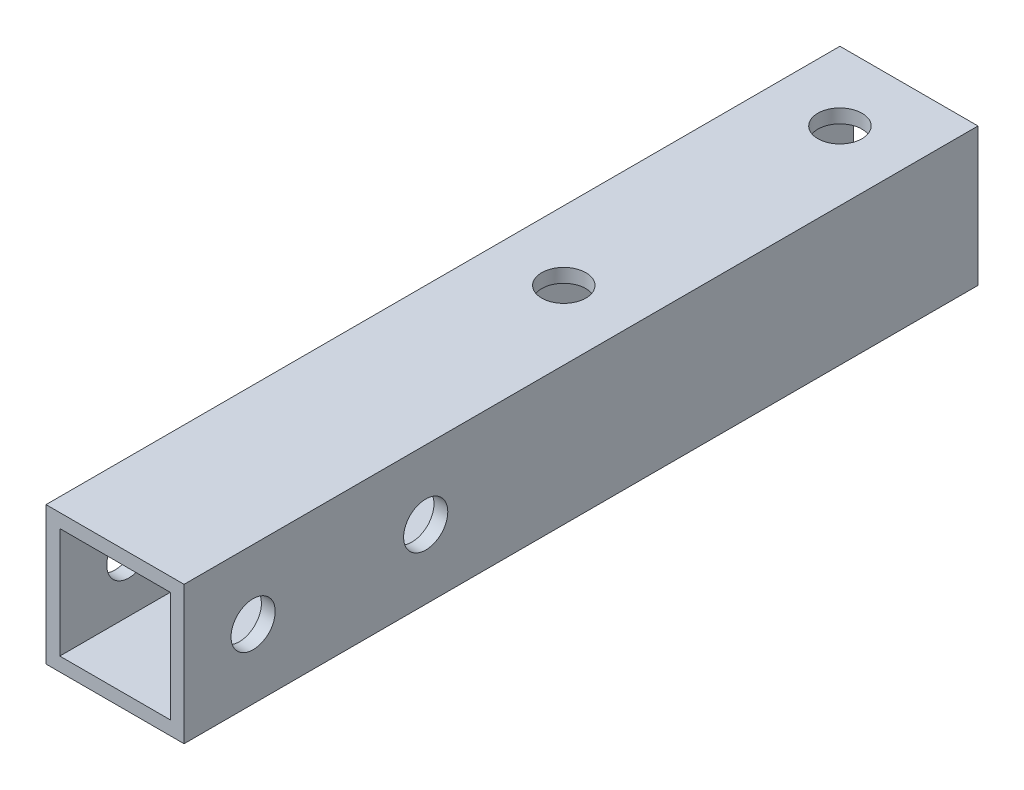
ISO-10303-21;
HEADER;
FILE_DESCRIPTION(('STEP AP214'),'2;1');
FILE_NAME('part.step','',(''),(''),'','','');
FILE_SCHEMA(('AUTOMOTIVE_DESIGN { 1 0 10303 214 1 1 1 1 }'));
ENDSEC;
DATA;
#1=APPLICATION_CONTEXT('core data for automotive mechanical design processes');
#2=APPLICATION_PROTOCOL_DEFINITION('international standard','automotive_design',2000,#1);
#3=PRODUCT_CONTEXT('',#1,'mechanical');
#4=PRODUCT('Part','Part','',(#3));
#5=PRODUCT_RELATED_PRODUCT_CATEGORY('part','',(#4));
#6=PRODUCT_DEFINITION_FORMATION('','',#4);
#7=PRODUCT_DEFINITION_CONTEXT('part definition',#1,'design');
#8=PRODUCT_DEFINITION('design','',#6,#7);
#9=PRODUCT_DEFINITION_SHAPE('','',#8);
#10=(LENGTH_UNIT() NAMED_UNIT(*) SI_UNIT(.MILLI.,.METRE.));
#11=(NAMED_UNIT(*) PLANE_ANGLE_UNIT() SI_UNIT($,.RADIAN.));
#12=(NAMED_UNIT(*) SI_UNIT($,.STERADIAN.) SOLID_ANGLE_UNIT());
#13=UNCERTAINTY_MEASURE_WITH_UNIT(LENGTH_MEASURE(1.E-05),#10,'distance_accuracy_value','');
#14=(GEOMETRIC_REPRESENTATION_CONTEXT(3) GLOBAL_UNCERTAINTY_ASSIGNED_CONTEXT((#13)) GLOBAL_UNIT_ASSIGNED_CONTEXT((#10,
#11,#12)) REPRESENTATION_CONTEXT('',''));
#15=CARTESIAN_POINT('',(0.,0.,0.));
#16=DIRECTION('',(0.,0.,1.));
#17=DIRECTION('',(1.,0.,0.));
#18=AXIS2_PLACEMENT_3D('',#15,#16,#17);
#19=CARTESIAN_POINT('',(0.,0.,57.5));
#20=DIRECTION('',(0.,0.,1.));
#21=DIRECTION('',(1.,0.,0.));
#22=AXIS2_PLACEMENT_3D('',#19,#20,#21);
#23=PLANE('',#22);
#24=DIRECTION('',(0.,1.,0.));
#25=VECTOR('',#24,1.);
#26=CARTESIAN_POINT('',(5.,-5.,57.5));
#27=LINE('',#26,#25);
#28=CARTESIAN_POINT('',(5.,-5.,57.5));
#29=VERTEX_POINT('',#28);
#30=CARTESIAN_POINT('',(5.,5.,57.5));
#31=VERTEX_POINT('',#30);
#32=EDGE_CURVE('E164',#29,#31,#27,.T.);
#33=ORIENTED_EDGE('',*,*,#32,.T.);
#34=DIRECTION('',(-1.,0.,0.));
#35=VECTOR('',#34,1.);
#36=CARTESIAN_POINT('',(-5.,5.,57.5));
#37=LINE('',#36,#35);
#38=CARTESIAN_POINT('',(-5.,5.,57.5));
#39=VERTEX_POINT('',#38);
#40=EDGE_CURVE('E167',#31,#39,#37,.T.);
#41=ORIENTED_EDGE('',*,*,#40,.T.);
#42=DIRECTION('',(0.,-1.,0.));
#43=VECTOR('',#42,1.);
#44=CARTESIAN_POINT('',(-5.,-5.,57.5));
#45=LINE('',#44,#43);
#46=CARTESIAN_POINT('',(-5.,-5.,57.5));
#47=VERTEX_POINT('',#46);
#48=EDGE_CURVE('E170',#39,#47,#45,.T.);
#49=ORIENTED_EDGE('',*,*,#48,.T.);
#50=DIRECTION('',(1.,0.,0.));
#51=VECTOR('',#50,1.);
#52=CARTESIAN_POINT('',(-5.,-5.,57.5));
#53=LINE('',#52,#51);
#54=EDGE_CURVE('E172',#47,#29,#53,.T.);
#55=ORIENTED_EDGE('',*,*,#54,.T.);
#56=EDGE_LOOP('',(#33,#41,#49,#55));
#57=FACE_BOUND('',#56,.T.);
#58=DIRECTION('',(-1.,0.,0.));
#59=VECTOR('',#58,1.);
#60=CARTESIAN_POINT('',(0.,4.,57.5));
#61=LINE('',#60,#59);
#62=CARTESIAN_POINT('',(4.,4.,57.5));
#63=VERTEX_POINT('',#62);
#64=CARTESIAN_POINT('',(-4.,4.,57.5));
#65=VERTEX_POINT('',#64);
#66=EDGE_CURVE('E134',#63,#65,#61,.T.);
#67=ORIENTED_EDGE('',*,*,#66,.F.);
#68=DIRECTION('',(0.,1.,0.));
#69=VECTOR('',#68,1.);
#70=CARTESIAN_POINT('',(4.,0.,57.5));
#71=LINE('',#70,#69);
#72=CARTESIAN_POINT('',(4.,-4.,57.5));
#73=VERTEX_POINT('',#72);
#74=EDGE_CURVE('E126',#73,#63,#71,.T.);
#75=ORIENTED_EDGE('',*,*,#74,.F.);
#76=DIRECTION('',(1.,0.,0.));
#77=VECTOR('',#76,1.);
#78=CARTESIAN_POINT('',(0.,-4.,57.5));
#79=LINE('',#78,#77);
#80=CARTESIAN_POINT('',(-4.,-4.,57.5));
#81=VERTEX_POINT('',#80);
#82=EDGE_CURVE('E148',#81,#73,#79,.T.);
#83=ORIENTED_EDGE('',*,*,#82,.F.);
#84=DIRECTION('',(0.,-1.,0.));
#85=VECTOR('',#84,1.);
#86=CARTESIAN_POINT('',(-4.,0.,57.5));
#87=LINE('',#86,#85);
#88=EDGE_CURVE('E146',#65,#81,#87,.T.);
#89=ORIENTED_EDGE('',*,*,#88,.F.);
#90=EDGE_LOOP('',(#67,#75,#83,#89));
#91=FACE_BOUND('',#90,.T.);
#92=ADVANCED_FACE('F59',(#57,#91),#23,.T.);
#93=CARTESIAN_POINT('',(0.,0.,0.));
#94=DIRECTION('',(0.,0.,1.));
#95=DIRECTION('',(1.,0.,0.));
#96=AXIS2_PLACEMENT_3D('',#93,#94,#95);
#97=PLANE('',#96);
#98=DIRECTION('',(0.,1.,0.));
#99=VECTOR('',#98,1.);
#100=CARTESIAN_POINT('',(5.,-5.,0.));
#101=LINE('',#100,#99);
#102=CARTESIAN_POINT('',(5.,-5.,0.));
#103=VERTEX_POINT('',#102);
#104=CARTESIAN_POINT('',(5.,5.,0.));
#105=VERTEX_POINT('',#104);
#106=EDGE_CURVE('E142',#103,#105,#101,.T.);
#107=ORIENTED_EDGE('',*,*,#106,.F.);
#108=DIRECTION('',(1.,0.,0.));
#109=VECTOR('',#108,1.);
#110=CARTESIAN_POINT('',(-5.,-5.,0.));
#111=LINE('',#110,#109);
#112=CARTESIAN_POINT('',(-5.,-5.,0.));
#113=VERTEX_POINT('',#112);
#114=EDGE_CURVE('E168',#113,#103,#111,.T.);
#115=ORIENTED_EDGE('',*,*,#114,.F.);
#116=DIRECTION('',(0.,-1.,0.));
#117=VECTOR('',#116,1.);
#118=CARTESIAN_POINT('',(-5.,-5.,0.));
#119=LINE('',#118,#117);
#120=CARTESIAN_POINT('',(-5.,5.,0.));
#121=VERTEX_POINT('',#120);
#122=EDGE_CURVE('E179',#121,#113,#119,.T.);
#123=ORIENTED_EDGE('',*,*,#122,.F.);
#124=DIRECTION('',(-1.,0.,0.));
#125=VECTOR('',#124,1.);
#126=CARTESIAN_POINT('',(-5.,5.,0.));
#127=LINE('',#126,#125);
#128=EDGE_CURVE('E177',#105,#121,#127,.T.);
#129=ORIENTED_EDGE('',*,*,#128,.F.);
#130=EDGE_LOOP('',(#107,#115,#123,#129));
#131=FACE_BOUND('',#130,.T.);
#132=DIRECTION('',(0.,1.,0.));
#133=VECTOR('',#132,1.);
#134=CARTESIAN_POINT('',(4.,0.,0.));
#135=LINE('',#134,#133);
#136=CARTESIAN_POINT('',(4.,-4.,0.));
#137=VERTEX_POINT('',#136);
#138=CARTESIAN_POINT('',(4.,4.,0.));
#139=VERTEX_POINT('',#138);
#140=EDGE_CURVE('E84',#137,#139,#135,.T.);
#141=ORIENTED_EDGE('',*,*,#140,.T.);
#142=DIRECTION('',(-1.,0.,0.));
#143=VECTOR('',#142,1.);
#144=CARTESIAN_POINT('',(0.,4.,0.));
#145=LINE('',#144,#143);
#146=CARTESIAN_POINT('',(-4.,4.,0.));
#147=VERTEX_POINT('',#146);
#148=EDGE_CURVE('E141',#139,#147,#145,.T.);
#149=ORIENTED_EDGE('',*,*,#148,.T.);
#150=DIRECTION('',(0.,-1.,0.));
#151=VECTOR('',#150,1.);
#152=CARTESIAN_POINT('',(-4.,0.,0.));
#153=LINE('',#152,#151);
#154=CARTESIAN_POINT('',(-4.,-4.,0.));
#155=VERTEX_POINT('',#154);
#156=EDGE_CURVE('E156',#147,#155,#153,.T.);
#157=ORIENTED_EDGE('',*,*,#156,.T.);
#158=DIRECTION('',(1.,0.,0.));
#159=VECTOR('',#158,1.);
#160=CARTESIAN_POINT('',(0.,-4.,0.));
#161=LINE('',#160,#159);
#162=EDGE_CURVE('E135',#155,#137,#161,.T.);
#163=ORIENTED_EDGE('',*,*,#162,.T.);
#164=EDGE_LOOP('',(#141,#149,#157,#163));
#165=FACE_BOUND('',#164,.T.);
#166=ADVANCED_FACE('F267',(#131,#165),#97,.F.);
#167=CARTESIAN_POINT('',(5.,-5.,57.5));
#168=DIRECTION('',(-1.,0.,0.));
#169=DIRECTION('',(0.,0.,1.));
#170=AXIS2_PLACEMENT_3D('',#167,#168,#169);
#171=PLANE('',#170);
#172=CARTESIAN_POINT('',(5.,0.,40.));
#173=DIRECTION('',(1.,0.,0.));
#174=DIRECTION('',(0.,0.,-1.));
#175=AXIS2_PLACEMENT_3D('',#172,#173,#174);
#176=CIRCLE('',#175,1.6);
#177=CARTESIAN_POINT('',(5.,0.,38.4));
#178=VERTEX_POINT('',#177);
#179=EDGE_CURVE('E205',#178,#178,#176,.T.);
#180=ORIENTED_EDGE('',*,*,#179,.F.);
#181=EDGE_LOOP('',(#180));
#182=FACE_BOUND('',#181,.T.);
#183=CARTESIAN_POINT('',(5.,0.,52.5));
#184=DIRECTION('',(1.,0.,0.));
#185=DIRECTION('',(0.,0.,-1.));
#186=AXIS2_PLACEMENT_3D('',#183,#184,#185);
#187=CIRCLE('',#186,1.6);
#188=CARTESIAN_POINT('',(5.,0.,50.9));
#189=VERTEX_POINT('',#188);
#190=EDGE_CURVE('E215',#189,#189,#187,.T.);
#191=ORIENTED_EDGE('',*,*,#190,.F.);
#192=EDGE_LOOP('',(#191));
#193=FACE_BOUND('',#192,.T.);
#194=ORIENTED_EDGE('',*,*,#106,.T.);
#195=DIRECTION('',(0.,0.,-1.));
#196=VECTOR('',#195,1.);
#197=CARTESIAN_POINT('',(5.,5.,57.5));
#198=LINE('',#197,#196);
#199=EDGE_CURVE('E12',#31,#105,#198,.T.);
#200=ORIENTED_EDGE('',*,*,#199,.F.);
#201=ORIENTED_EDGE('',*,*,#32,.F.);
#202=DIRECTION('',(0.,0.,-1.));
#203=VECTOR('',#202,1.);
#204=CARTESIAN_POINT('',(5.,-5.,57.5));
#205=LINE('',#204,#203);
#206=EDGE_CURVE('E174',#29,#103,#205,.T.);
#207=ORIENTED_EDGE('',*,*,#206,.T.);
#208=EDGE_LOOP('',(#194,#200,#201,#207));
#209=FACE_BOUND('',#208,.T.);
#210=ADVANCED_FACE('F61',(#182,#193,#209),#171,.F.);
#211=CARTESIAN_POINT('',(-5.,5.,57.5));
#212=DIRECTION('',(0.,-1.,0.));
#213=DIRECTION('',(0.,0.,-1.));
#214=AXIS2_PLACEMENT_3D('',#211,#212,#213);
#215=PLANE('',#214);
#216=CARTESIAN_POINT('',(0.,5.,25.));
#217=DIRECTION('',(0.,1.,0.));
#218=DIRECTION('',(0.,0.,1.));
#219=AXIS2_PLACEMENT_3D('',#216,#217,#218);
#220=CIRCLE('',#219,1.6);
#221=CARTESIAN_POINT('',(0.,5.,26.6));
#222=VERTEX_POINT('',#221);
#223=EDGE_CURVE('E224',#222,#222,#220,.T.);
#224=ORIENTED_EDGE('',*,*,#223,.F.);
#225=EDGE_LOOP('',(#224));
#226=FACE_BOUND('',#225,.T.);
#227=CARTESIAN_POINT('',(0.,5.,5.));
#228=DIRECTION('',(0.,1.,0.));
#229=DIRECTION('',(0.,0.,1.));
#230=AXIS2_PLACEMENT_3D('',#227,#228,#229);
#231=CIRCLE('',#230,1.6);
#232=CARTESIAN_POINT('',(0.,5.,6.6));
#233=VERTEX_POINT('',#232);
#234=EDGE_CURVE('E221',#233,#233,#231,.T.);
#235=ORIENTED_EDGE('',*,*,#234,.F.);
#236=EDGE_LOOP('',(#235));
#237=FACE_BOUND('',#236,.T.);
#238=ORIENTED_EDGE('',*,*,#128,.T.);
#239=DIRECTION('',(0.,0.,-1.));
#240=VECTOR('',#239,1.);
#241=CARTESIAN_POINT('',(-5.,5.,57.5));
#242=LINE('',#241,#240);
#243=EDGE_CURVE('E68',#39,#121,#242,.T.);
#244=ORIENTED_EDGE('',*,*,#243,.F.);
#245=ORIENTED_EDGE('',*,*,#40,.F.);
#246=ORIENTED_EDGE('',*,*,#199,.T.);
#247=EDGE_LOOP('',(#238,#244,#245,#246));
#248=FACE_BOUND('',#247,.T.);
#249=ADVANCED_FACE('F253',(#226,#237,#248),#215,.F.);
#250=CARTESIAN_POINT('',(-5.,-5.,57.5));
#251=DIRECTION('',(1.,0.,0.));
#252=DIRECTION('',(0.,0.,-1.));
#253=AXIS2_PLACEMENT_3D('',#250,#251,#252);
#254=PLANE('',#253);
#255=CARTESIAN_POINT('',(-5.,0.,40.));
#256=DIRECTION('',(1.,0.,0.));
#257=DIRECTION('',(0.,0.,-1.));
#258=AXIS2_PLACEMENT_3D('',#255,#256,#257);
#259=CIRCLE('',#258,1.6);
#260=CARTESIAN_POINT('',(-5.,0.,38.4));
#261=VERTEX_POINT('',#260);
#262=EDGE_CURVE('E199',#261,#261,#259,.T.);
#263=ORIENTED_EDGE('',*,*,#262,.T.);
#264=EDGE_LOOP('',(#263));
#265=FACE_BOUND('',#264,.T.);
#266=CARTESIAN_POINT('',(-5.,0.,52.5));
#267=DIRECTION('',(1.,0.,0.));
#268=DIRECTION('',(0.,0.,-1.));
#269=AXIS2_PLACEMENT_3D('',#266,#267,#268);
#270=CIRCLE('',#269,1.6);
#271=CARTESIAN_POINT('',(-5.,0.,50.9));
#272=VERTEX_POINT('',#271);
#273=EDGE_CURVE('E210',#272,#272,#270,.T.);
#274=ORIENTED_EDGE('',*,*,#273,.T.);
#275=EDGE_LOOP('',(#274));
#276=FACE_BOUND('',#275,.T.);
#277=ORIENTED_EDGE('',*,*,#122,.T.);
#278=DIRECTION('',(0.,0.,-1.));
#279=VECTOR('',#278,1.);
#280=CARTESIAN_POINT('',(-5.,-5.,57.5));
#281=LINE('',#280,#279);
#282=EDGE_CURVE('E184',#47,#113,#281,.T.);
#283=ORIENTED_EDGE('',*,*,#282,.F.);
#284=ORIENTED_EDGE('',*,*,#48,.F.);
#285=ORIENTED_EDGE('',*,*,#243,.T.);
#286=EDGE_LOOP('',(#277,#283,#284,#285));
#287=FACE_BOUND('',#286,.T.);
#288=ADVANCED_FACE('F256',(#265,#276,#287),#254,.F.);
#289=CARTESIAN_POINT('',(-5.,-5.,57.5));
#290=DIRECTION('',(0.,1.,0.));
#291=DIRECTION('',(0.,0.,1.));
#292=AXIS2_PLACEMENT_3D('',#289,#290,#291);
#293=PLANE('',#292);
#294=CARTESIAN_POINT('',(0.,-5.,25.));
#295=DIRECTION('',(0.,1.,0.));
#296=DIRECTION('',(0.,0.,1.));
#297=AXIS2_PLACEMENT_3D('',#294,#295,#296);
#298=CIRCLE('',#297,1.6);
#299=CARTESIAN_POINT('',(0.,-5.,26.6));
#300=VERTEX_POINT('',#299);
#301=EDGE_CURVE('E193',#300,#300,#298,.T.);
#302=ORIENTED_EDGE('',*,*,#301,.T.);
#303=EDGE_LOOP('',(#302));
#304=FACE_BOUND('',#303,.T.);
#305=CARTESIAN_POINT('',(0.,-5.,5.));
#306=DIRECTION('',(0.,1.,0.));
#307=DIRECTION('',(0.,0.,1.));
#308=AXIS2_PLACEMENT_3D('',#305,#306,#307);
#309=CIRCLE('',#308,1.6);
#310=CARTESIAN_POINT('',(0.,-5.,6.6));
#311=VERTEX_POINT('',#310);
#312=EDGE_CURVE('E227',#311,#311,#309,.T.);
#313=ORIENTED_EDGE('',*,*,#312,.T.);
#314=EDGE_LOOP('',(#313));
#315=FACE_BOUND('',#314,.T.);
#316=ORIENTED_EDGE('',*,*,#114,.T.);
#317=ORIENTED_EDGE('',*,*,#206,.F.);
#318=ORIENTED_EDGE('',*,*,#54,.F.);
#319=ORIENTED_EDGE('',*,*,#282,.T.);
#320=EDGE_LOOP('',(#316,#317,#318,#319));
#321=FACE_BOUND('',#320,.T.);
#322=ADVANCED_FACE('F271',(#304,#315,#321),#293,.F.);
#323=CARTESIAN_POINT('',(4.,0.,57.5));
#324=DIRECTION('',(-1.,0.,0.));
#325=DIRECTION('',(0.,0.,1.));
#326=AXIS2_PLACEMENT_3D('',#323,#324,#325);
#327=PLANE('',#326);
#328=CARTESIAN_POINT('',(4.,0.,40.));
#329=DIRECTION('',(-1.,0.,0.));
#330=DIRECTION('',(0.,0.,1.));
#331=AXIS2_PLACEMENT_3D('',#328,#329,#330);
#332=CIRCLE('',#331,1.6);
#333=CARTESIAN_POINT('',(4.,0.,41.6));
#334=VERTEX_POINT('',#333);
#335=EDGE_CURVE('E218',#334,#334,#332,.T.);
#336=ORIENTED_EDGE('',*,*,#335,.F.);
#337=EDGE_LOOP('',(#336));
#338=FACE_BOUND('',#337,.T.);
#339=CARTESIAN_POINT('',(4.,0.,52.5));
#340=DIRECTION('',(-1.,0.,0.));
#341=DIRECTION('',(0.,0.,1.));
#342=AXIS2_PLACEMENT_3D('',#339,#340,#341);
#343=CIRCLE('',#342,1.6);
#344=CARTESIAN_POINT('',(4.,0.,54.1));
#345=VERTEX_POINT('',#344);
#346=EDGE_CURVE('E198',#345,#345,#343,.T.);
#347=ORIENTED_EDGE('',*,*,#346,.F.);
#348=EDGE_LOOP('',(#347));
#349=FACE_BOUND('',#348,.T.);
#350=ORIENTED_EDGE('',*,*,#140,.F.);
#351=DIRECTION('',(0.,0.,-1.));
#352=VECTOR('',#351,1.);
#353=CARTESIAN_POINT('',(4.,-4.,57.5));
#354=LINE('',#353,#352);
#355=EDGE_CURVE('E130',#73,#137,#354,.T.);
#356=ORIENTED_EDGE('',*,*,#355,.F.);
#357=ORIENTED_EDGE('',*,*,#74,.T.);
#358=DIRECTION('',(0.,0.,-1.));
#359=VECTOR('',#358,1.);
#360=CARTESIAN_POINT('',(4.,4.,57.5));
#361=LINE('',#360,#359);
#362=EDGE_CURVE('E129',#63,#139,#361,.T.);
#363=ORIENTED_EDGE('',*,*,#362,.T.);
#364=EDGE_LOOP('',(#350,#356,#357,#363));
#365=FACE_BOUND('',#364,.T.);
#366=ADVANCED_FACE('F128',(#338,#349,#365),#327,.T.);
#367=CARTESIAN_POINT('',(0.,4.,57.5));
#368=DIRECTION('',(0.,-1.,0.));
#369=DIRECTION('',(0.,0.,-1.));
#370=AXIS2_PLACEMENT_3D('',#367,#368,#369);
#371=PLANE('',#370);
#372=CARTESIAN_POINT('',(0.,4.,25.));
#373=DIRECTION('',(0.,-1.,0.));
#374=DIRECTION('',(0.,0.,-1.));
#375=AXIS2_PLACEMENT_3D('',#372,#373,#374);
#376=CIRCLE('',#375,1.6);
#377=CARTESIAN_POINT('',(0.,4.,23.4));
#378=VERTEX_POINT('',#377);
#379=EDGE_CURVE('E154',#378,#378,#376,.T.);
#380=ORIENTED_EDGE('',*,*,#379,.F.);
#381=EDGE_LOOP('',(#380));
#382=FACE_BOUND('',#381,.T.);
#383=CARTESIAN_POINT('',(0.,4.,5.));
#384=DIRECTION('',(0.,-1.,0.));
#385=DIRECTION('',(0.,0.,-1.));
#386=AXIS2_PLACEMENT_3D('',#383,#384,#385);
#387=CIRCLE('',#386,1.6);
#388=CARTESIAN_POINT('',(0.,4.,3.4));
#389=VERTEX_POINT('',#388);
#390=EDGE_CURVE('E192',#389,#389,#387,.T.);
#391=ORIENTED_EDGE('',*,*,#390,.F.);
#392=EDGE_LOOP('',(#391));
#393=FACE_BOUND('',#392,.T.);
#394=ORIENTED_EDGE('',*,*,#148,.F.);
#395=ORIENTED_EDGE('',*,*,#362,.F.);
#396=ORIENTED_EDGE('',*,*,#66,.T.);
#397=DIRECTION('',(0.,0.,-1.));
#398=VECTOR('',#397,1.);
#399=CARTESIAN_POINT('',(-4.,4.,57.5));
#400=LINE('',#399,#398);
#401=EDGE_CURVE('E143',#65,#147,#400,.T.);
#402=ORIENTED_EDGE('',*,*,#401,.T.);
#403=EDGE_LOOP('',(#394,#395,#396,#402));
#404=FACE_BOUND('',#403,.T.);
#405=ADVANCED_FACE('F138',(#382,#393,#404),#371,.T.);
#406=CARTESIAN_POINT('',(-4.,0.,57.5));
#407=DIRECTION('',(1.,0.,0.));
#408=DIRECTION('',(0.,0.,-1.));
#409=AXIS2_PLACEMENT_3D('',#406,#407,#408);
#410=PLANE('',#409);
#411=CARTESIAN_POINT('',(-4.,0.,40.));
#412=DIRECTION('',(1.,0.,0.));
#413=DIRECTION('',(0.,0.,-1.));
#414=AXIS2_PLACEMENT_3D('',#411,#412,#413);
#415=CIRCLE('',#414,1.6);
#416=CARTESIAN_POINT('',(-4.,0.,38.4));
#417=VERTEX_POINT('',#416);
#418=EDGE_CURVE('E63',#417,#417,#415,.T.);
#419=ORIENTED_EDGE('',*,*,#418,.F.);
#420=EDGE_LOOP('',(#419));
#421=FACE_BOUND('',#420,.T.);
#422=CARTESIAN_POINT('',(-4.,0.,52.5));
#423=DIRECTION('',(1.,0.,0.));
#424=DIRECTION('',(0.,0.,-1.));
#425=AXIS2_PLACEMENT_3D('',#422,#423,#424);
#426=CIRCLE('',#425,1.6);
#427=CARTESIAN_POINT('',(-4.,0.,50.9));
#428=VERTEX_POINT('',#427);
#429=EDGE_CURVE('E196',#428,#428,#426,.T.);
#430=ORIENTED_EDGE('',*,*,#429,.F.);
#431=EDGE_LOOP('',(#430));
#432=FACE_BOUND('',#431,.T.);
#433=ORIENTED_EDGE('',*,*,#156,.F.);
#434=ORIENTED_EDGE('',*,*,#401,.F.);
#435=ORIENTED_EDGE('',*,*,#88,.T.);
#436=DIRECTION('',(0.,0.,-1.));
#437=VECTOR('',#436,1.);
#438=CARTESIAN_POINT('',(-4.,-4.,57.5));
#439=LINE('',#438,#437);
#440=EDGE_CURVE('E76',#81,#155,#439,.T.);
#441=ORIENTED_EDGE('',*,*,#440,.T.);
#442=EDGE_LOOP('',(#433,#434,#435,#441));
#443=FACE_BOUND('',#442,.T.);
#444=ADVANCED_FACE('F241',(#421,#432,#443),#410,.T.);
#445=CARTESIAN_POINT('',(0.,-4.,57.5));
#446=DIRECTION('',(0.,1.,0.));
#447=DIRECTION('',(0.,0.,1.));
#448=AXIS2_PLACEMENT_3D('',#445,#446,#447);
#449=PLANE('',#448);
#450=CARTESIAN_POINT('',(0.,-4.,25.));
#451=DIRECTION('',(0.,1.,0.));
#452=DIRECTION('',(0.,0.,1.));
#453=AXIS2_PLACEMENT_3D('',#450,#451,#452);
#454=CIRCLE('',#453,1.6);
#455=CARTESIAN_POINT('',(0.,-4.,26.6));
#456=VERTEX_POINT('',#455);
#457=EDGE_CURVE('E194',#456,#456,#454,.T.);
#458=ORIENTED_EDGE('',*,*,#457,.F.);
#459=EDGE_LOOP('',(#458));
#460=FACE_BOUND('',#459,.T.);
#461=CARTESIAN_POINT('',(0.,-4.,5.));
#462=DIRECTION('',(0.,1.,0.));
#463=DIRECTION('',(0.,0.,1.));
#464=AXIS2_PLACEMENT_3D('',#461,#462,#463);
#465=CIRCLE('',#464,1.6);
#466=CARTESIAN_POINT('',(0.,-4.,6.6));
#467=VERTEX_POINT('',#466);
#468=EDGE_CURVE('E189',#467,#467,#465,.T.);
#469=ORIENTED_EDGE('',*,*,#468,.F.);
#470=EDGE_LOOP('',(#469));
#471=FACE_BOUND('',#470,.T.);
#472=ORIENTED_EDGE('',*,*,#162,.F.);
#473=ORIENTED_EDGE('',*,*,#440,.F.);
#474=ORIENTED_EDGE('',*,*,#82,.T.);
#475=ORIENTED_EDGE('',*,*,#355,.T.);
#476=EDGE_LOOP('',(#472,#473,#474,#475));
#477=FACE_BOUND('',#476,.T.);
#478=ADVANCED_FACE('F353',(#460,#471,#477),#449,.T.);
#479=CARTESIAN_POINT('',(0.,-5.,5.));
#480=DIRECTION('',(0.,1.,0.));
#481=DIRECTION('',(0.,0.,1.));
#482=AXIS2_PLACEMENT_3D('',#479,#480,#481);
#483=CYLINDRICAL_SURFACE('',#482,1.6);
#484=ORIENTED_EDGE('',*,*,#468,.T.);
#485=EDGE_LOOP('',(#484));
#486=FACE_BOUND('',#485,.T.);
#487=ORIENTED_EDGE('',*,*,#312,.F.);
#488=EDGE_LOOP('',(#487));
#489=FACE_BOUND('',#488,.T.);
#490=ADVANCED_FACE('F250',(#486,#489),#483,.F.);
#491=CARTESIAN_POINT('',(0.,-5.,25.));
#492=DIRECTION('',(0.,1.,0.));
#493=DIRECTION('',(0.,0.,1.));
#494=AXIS2_PLACEMENT_3D('',#491,#492,#493);
#495=CYLINDRICAL_SURFACE('',#494,1.6);
#496=ORIENTED_EDGE('',*,*,#457,.T.);
#497=EDGE_LOOP('',(#496));
#498=FACE_BOUND('',#497,.T.);
#499=ORIENTED_EDGE('',*,*,#301,.F.);
#500=EDGE_LOOP('',(#499));
#501=FACE_BOUND('',#500,.T.);
#502=ADVANCED_FACE('F248',(#498,#501),#495,.F.);
#503=ORIENTED_EDGE('',*,*,#390,.T.);
#504=EDGE_LOOP('',(#503));
#505=FACE_BOUND('',#504,.T.);
#506=ORIENTED_EDGE('',*,*,#234,.T.);
#507=EDGE_LOOP('',(#506));
#508=FACE_BOUND('',#507,.T.);
#509=ADVANCED_FACE('F245',(#505,#508),#483,.F.);
#510=ORIENTED_EDGE('',*,*,#379,.T.);
#511=EDGE_LOOP('',(#510));
#512=FACE_BOUND('',#511,.T.);
#513=ORIENTED_EDGE('',*,*,#223,.T.);
#514=EDGE_LOOP('',(#513));
#515=FACE_BOUND('',#514,.T.);
#516=ADVANCED_FACE('F236',(#512,#515),#495,.F.);
#517=CARTESIAN_POINT('',(-5.,0.,52.5));
#518=DIRECTION('',(1.,0.,0.));
#519=DIRECTION('',(0.,0.,-1.));
#520=AXIS2_PLACEMENT_3D('',#517,#518,#519);
#521=CYLINDRICAL_SURFACE('',#520,1.6);
#522=ORIENTED_EDGE('',*,*,#429,.T.);
#523=EDGE_LOOP('',(#522));
#524=FACE_BOUND('',#523,.T.);
#525=ORIENTED_EDGE('',*,*,#273,.F.);
#526=EDGE_LOOP('',(#525));
#527=FACE_BOUND('',#526,.T.);
#528=ADVANCED_FACE('F293',(#524,#527),#521,.F.);
#529=CARTESIAN_POINT('',(-5.,0.,40.));
#530=DIRECTION('',(1.,0.,0.));
#531=DIRECTION('',(0.,0.,-1.));
#532=AXIS2_PLACEMENT_3D('',#529,#530,#531);
#533=CYLINDRICAL_SURFACE('',#532,1.6);
#534=ORIENTED_EDGE('',*,*,#418,.T.);
#535=EDGE_LOOP('',(#534));
#536=FACE_BOUND('',#535,.T.);
#537=ORIENTED_EDGE('',*,*,#262,.F.);
#538=EDGE_LOOP('',(#537));
#539=FACE_BOUND('',#538,.T.);
#540=ADVANCED_FACE('F295',(#536,#539),#533,.F.);
#541=ORIENTED_EDGE('',*,*,#346,.T.);
#542=EDGE_LOOP('',(#541));
#543=FACE_BOUND('',#542,.T.);
#544=ORIENTED_EDGE('',*,*,#190,.T.);
#545=EDGE_LOOP('',(#544));
#546=FACE_BOUND('',#545,.T.);
#547=ADVANCED_FACE('F297',(#543,#546),#521,.F.);
#548=ORIENTED_EDGE('',*,*,#335,.T.);
#549=EDGE_LOOP('',(#548));
#550=FACE_BOUND('',#549,.T.);
#551=ORIENTED_EDGE('',*,*,#179,.T.);
#552=EDGE_LOOP('',(#551));
#553=FACE_BOUND('',#552,.T.);
#554=ADVANCED_FACE('F304',(#550,#553),#533,.F.);
#555=CLOSED_SHELL('',(#92,#166,#210,#249,#288,#322,#366,#405,#444,#478,#490,#502,#509,#516,#528,
#540,#547,#554));
#556=MANIFOLD_SOLID_BREP('B2',#555);
#557=ADVANCED_BREP_SHAPE_REPRESENTATION('',(#18,#556),#14);
#558=SHAPE_DEFINITION_REPRESENTATION(#9,#557);
ENDSEC;
END-ISO-10303-21;
